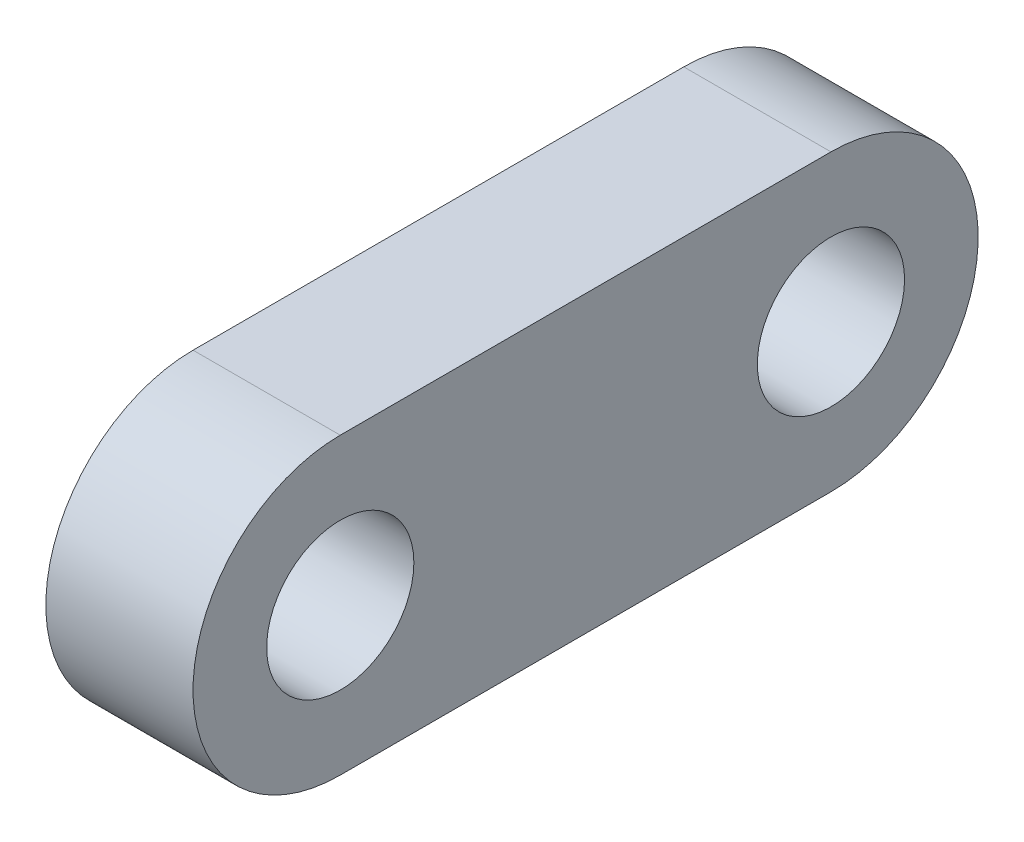
ISO-10303-21;
HEADER;
FILE_DESCRIPTION(('STEP AP214'),'2;1');
FILE_NAME('part.step','',(''),(''),'','','');
FILE_SCHEMA(('AUTOMOTIVE_DESIGN { 1 0 10303 214 1 1 1 1 }'));
ENDSEC;
DATA;
#1=APPLICATION_CONTEXT('core data for automotive mechanical design processes');
#2=APPLICATION_PROTOCOL_DEFINITION('international standard','automotive_design',2000,#1);
#3=PRODUCT_CONTEXT('',#1,'mechanical');
#4=PRODUCT('Part','Part','',(#3));
#5=PRODUCT_RELATED_PRODUCT_CATEGORY('part','',(#4));
#6=PRODUCT_DEFINITION_FORMATION('','',#4);
#7=PRODUCT_DEFINITION_CONTEXT('part definition',#1,'design');
#8=PRODUCT_DEFINITION('design','',#6,#7);
#9=PRODUCT_DEFINITION_SHAPE('','',#8);
#10=(LENGTH_UNIT() NAMED_UNIT(*) SI_UNIT(.MILLI.,.METRE.));
#11=(NAMED_UNIT(*) PLANE_ANGLE_UNIT() SI_UNIT($,.RADIAN.));
#12=(NAMED_UNIT(*) SI_UNIT($,.STERADIAN.) SOLID_ANGLE_UNIT());
#13=UNCERTAINTY_MEASURE_WITH_UNIT(LENGTH_MEASURE(1.E-05),#10,'distance_accuracy_value','');
#14=(GEOMETRIC_REPRESENTATION_CONTEXT(3) GLOBAL_UNCERTAINTY_ASSIGNED_CONTEXT((#13)) GLOBAL_UNIT_ASSIGNED_CONTEXT((#10,
#11,#12)) REPRESENTATION_CONTEXT('',''));
#15=CARTESIAN_POINT('',(0.,0.,0.));
#16=DIRECTION('',(0.,0.,1.));
#17=DIRECTION('',(1.,0.,0.));
#18=AXIS2_PLACEMENT_3D('',#15,#16,#17);
#19=CARTESIAN_POINT('',(3.,1.5,0.));
#20=DIRECTION('',(1.,0.,0.));
#21=DIRECTION('',(0.,0.,-1.));
#22=AXIS2_PLACEMENT_3D('',#19,#20,#21);
#23=PLANE('',#22);
#24=CARTESIAN_POINT('',(3.,1.5,0.));
#25=DIRECTION('',(1.,0.,0.));
#26=DIRECTION('',(0.,0.,-1.));
#27=AXIS2_PLACEMENT_3D('',#24,#25,#26);
#28=CIRCLE('',#27,1.5);
#29=CARTESIAN_POINT('',(3.,1.5,-1.5));
#30=VERTEX_POINT('',#29);
#31=EDGE_CURVE('E107',#30,#30,#28,.T.);
#32=ORIENTED_EDGE('',*,*,#31,.F.);
#33=EDGE_LOOP('',(#32));
#34=FACE_BOUND('',#33,.T.);
#35=CARTESIAN_POINT('',(3.,1.5,0.));
#36=DIRECTION('',(1.,0.,0.));
#37=DIRECTION('',(0.,0.,-1.));
#38=AXIS2_PLACEMENT_3D('',#35,#36,#37);
#39=CIRCLE('',#38,3.);
#40=CARTESIAN_POINT('',(3.,4.5,0.));
#41=VERTEX_POINT('',#40);
#42=CARTESIAN_POINT('',(3.,-1.5,0.));
#43=VERTEX_POINT('',#42);
#44=EDGE_CURVE('E92',#41,#43,#39,.T.);
#45=ORIENTED_EDGE('',*,*,#44,.T.);
#46=DIRECTION('',(0.,0.,-1.));
#47=VECTOR('',#46,1.);
#48=CARTESIAN_POINT('',(3.,-1.5,0.));
#49=LINE('',#48,#47);
#50=CARTESIAN_POINT('',(3.,-1.5,-10.));
#51=VERTEX_POINT('',#50);
#52=EDGE_CURVE('E87',#43,#51,#49,.T.);
#53=ORIENTED_EDGE('',*,*,#52,.T.);
#54=CARTESIAN_POINT('',(3.,1.5,-10.));
#55=DIRECTION('',(1.,0.,0.));
#56=DIRECTION('',(0.,0.,-1.));
#57=AXIS2_PLACEMENT_3D('',#54,#55,#56);
#58=CIRCLE('',#57,3.);
#59=CARTESIAN_POINT('',(3.,4.5,-10.));
#60=VERTEX_POINT('',#59);
#61=EDGE_CURVE('E90',#51,#60,#58,.T.);
#62=ORIENTED_EDGE('',*,*,#61,.T.);
#63=DIRECTION('',(0.,0.,1.));
#64=VECTOR('',#63,1.);
#65=CARTESIAN_POINT('',(3.,4.5,0.));
#66=LINE('',#65,#64);
#67=EDGE_CURVE('E57',#60,#41,#66,.T.);
#68=ORIENTED_EDGE('',*,*,#67,.T.);
#69=EDGE_LOOP('',(#45,#53,#62,#68));
#70=FACE_BOUND('',#69,.T.);
#71=CARTESIAN_POINT('',(3.,1.5,-10.));
#72=DIRECTION('',(1.,0.,0.));
#73=DIRECTION('',(0.,0.,-1.));
#74=AXIS2_PLACEMENT_3D('',#71,#72,#73);
#75=CIRCLE('',#74,1.5);
#76=CARTESIAN_POINT('',(3.,1.5,-11.5));
#77=VERTEX_POINT('',#76);
#78=EDGE_CURVE('E122',#77,#77,#75,.T.);
#79=ORIENTED_EDGE('',*,*,#78,.F.);
#80=EDGE_LOOP('',(#79));
#81=FACE_BOUND('',#80,.T.);
#82=ADVANCED_FACE('F40',(#34,#70,#81),#23,.T.);
#83=CARTESIAN_POINT('',(0.,1.5,0.));
#84=DIRECTION('',(1.,0.,0.));
#85=DIRECTION('',(0.,0.,-1.));
#86=AXIS2_PLACEMENT_3D('',#83,#84,#85);
#87=PLANE('',#86);
#88=CARTESIAN_POINT('',(0.,1.5,0.));
#89=DIRECTION('',(1.,0.,0.));
#90=DIRECTION('',(0.,0.,-1.));
#91=AXIS2_PLACEMENT_3D('',#88,#89,#90);
#92=CIRCLE('',#91,3.);
#93=CARTESIAN_POINT('',(0.,4.5,0.));
#94=VERTEX_POINT('',#93);
#95=CARTESIAN_POINT('',(0.,-1.5,0.));
#96=VERTEX_POINT('',#95);
#97=EDGE_CURVE('E104',#94,#96,#92,.T.);
#98=ORIENTED_EDGE('',*,*,#97,.F.);
#99=DIRECTION('',(0.,0.,1.));
#100=VECTOR('',#99,1.);
#101=CARTESIAN_POINT('',(0.,4.5,0.));
#102=LINE('',#101,#100);
#103=CARTESIAN_POINT('',(0.,4.5,-10.));
#104=VERTEX_POINT('',#103);
#105=EDGE_CURVE('E80',#104,#94,#102,.T.);
#106=ORIENTED_EDGE('',*,*,#105,.F.);
#107=CARTESIAN_POINT('',(0.,1.5,-10.));
#108=DIRECTION('',(1.,0.,0.));
#109=DIRECTION('',(0.,0.,-1.));
#110=AXIS2_PLACEMENT_3D('',#107,#108,#109);
#111=CIRCLE('',#110,3.);
#112=CARTESIAN_POINT('',(0.,-1.5,-10.));
#113=VERTEX_POINT('',#112);
#114=EDGE_CURVE('E74',#113,#104,#111,.T.);
#115=ORIENTED_EDGE('',*,*,#114,.F.);
#116=DIRECTION('',(0.,0.,-1.));
#117=VECTOR('',#116,1.);
#118=CARTESIAN_POINT('',(0.,-1.5,0.));
#119=LINE('',#118,#117);
#120=EDGE_CURVE('E96',#96,#113,#119,.T.);
#121=ORIENTED_EDGE('',*,*,#120,.F.);
#122=EDGE_LOOP('',(#98,#106,#115,#121));
#123=FACE_BOUND('',#122,.T.);
#124=CARTESIAN_POINT('',(0.,1.5,0.));
#125=DIRECTION('',(1.,0.,0.));
#126=DIRECTION('',(0.,0.,-1.));
#127=AXIS2_PLACEMENT_3D('',#124,#125,#126);
#128=CIRCLE('',#127,1.5);
#129=CARTESIAN_POINT('',(0.,1.5,-1.5));
#130=VERTEX_POINT('',#129);
#131=EDGE_CURVE('E119',#130,#130,#128,.T.);
#132=ORIENTED_EDGE('',*,*,#131,.T.);
#133=EDGE_LOOP('',(#132));
#134=FACE_BOUND('',#133,.T.);
#135=CARTESIAN_POINT('',(0.,1.5,-10.));
#136=DIRECTION('',(1.,0.,0.));
#137=DIRECTION('',(0.,0.,-1.));
#138=AXIS2_PLACEMENT_3D('',#135,#136,#137);
#139=CIRCLE('',#138,1.5);
#140=CARTESIAN_POINT('',(0.,1.5,-11.5));
#141=VERTEX_POINT('',#140);
#142=EDGE_CURVE('E125',#141,#141,#139,.T.);
#143=ORIENTED_EDGE('',*,*,#142,.T.);
#144=EDGE_LOOP('',(#143));
#145=FACE_BOUND('',#144,.T.);
#146=ADVANCED_FACE('F115',(#123,#134,#145),#87,.F.);
#147=CARTESIAN_POINT('',(3.,1.5,0.));
#148=DIRECTION('',(-1.,0.,0.));
#149=DIRECTION('',(0.,0.,1.));
#150=AXIS2_PLACEMENT_3D('',#147,#148,#149);
#151=CYLINDRICAL_SURFACE('',#150,3.);
#152=ORIENTED_EDGE('',*,*,#97,.T.);
#153=DIRECTION('',(-1.,0.,0.));
#154=VECTOR('',#153,1.);
#155=CARTESIAN_POINT('',(3.,-1.5,0.));
#156=LINE('',#155,#154);
#157=EDGE_CURVE('E11',#43,#96,#156,.T.);
#158=ORIENTED_EDGE('',*,*,#157,.F.);
#159=ORIENTED_EDGE('',*,*,#44,.F.);
#160=DIRECTION('',(-1.,0.,0.));
#161=VECTOR('',#160,1.);
#162=CARTESIAN_POINT('',(3.,4.5,0.));
#163=LINE('',#162,#161);
#164=EDGE_CURVE('E100',#41,#94,#163,.T.);
#165=ORIENTED_EDGE('',*,*,#164,.T.);
#166=EDGE_LOOP('',(#152,#158,#159,#165));
#167=FACE_BOUND('',#166,.T.);
#168=ADVANCED_FACE('F42',(#167),#151,.T.);
#169=CARTESIAN_POINT('',(3.,-1.5,0.));
#170=DIRECTION('',(0.,1.,0.));
#171=DIRECTION('',(0.,0.,1.));
#172=AXIS2_PLACEMENT_3D('',#169,#170,#171);
#173=PLANE('',#172);
#174=ORIENTED_EDGE('',*,*,#120,.T.);
#175=DIRECTION('',(-1.,0.,0.));
#176=VECTOR('',#175,1.);
#177=CARTESIAN_POINT('',(3.,-1.5,-10.));
#178=LINE('',#177,#176);
#179=EDGE_CURVE('E49',#51,#113,#178,.T.);
#180=ORIENTED_EDGE('',*,*,#179,.F.);
#181=ORIENTED_EDGE('',*,*,#52,.F.);
#182=ORIENTED_EDGE('',*,*,#157,.T.);
#183=EDGE_LOOP('',(#174,#180,#181,#182));
#184=FACE_BOUND('',#183,.T.);
#185=ADVANCED_FACE('F95',(#184),#173,.F.);
#186=CARTESIAN_POINT('',(3.,1.5,-10.));
#187=DIRECTION('',(-1.,0.,0.));
#188=DIRECTION('',(0.,0.,1.));
#189=AXIS2_PLACEMENT_3D('',#186,#187,#188);
#190=CYLINDRICAL_SURFACE('',#189,3.);
#191=ORIENTED_EDGE('',*,*,#114,.T.);
#192=DIRECTION('',(-1.,0.,0.));
#193=VECTOR('',#192,1.);
#194=CARTESIAN_POINT('',(3.,4.5,-10.));
#195=LINE('',#194,#193);
#196=EDGE_CURVE('E97',#60,#104,#195,.T.);
#197=ORIENTED_EDGE('',*,*,#196,.F.);
#198=ORIENTED_EDGE('',*,*,#61,.F.);
#199=ORIENTED_EDGE('',*,*,#179,.T.);
#200=EDGE_LOOP('',(#191,#197,#198,#199));
#201=FACE_BOUND('',#200,.T.);
#202=ADVANCED_FACE('F98',(#201),#190,.T.);
#203=CARTESIAN_POINT('',(3.,4.5,0.));
#204=DIRECTION('',(0.,-1.,0.));
#205=DIRECTION('',(0.,0.,-1.));
#206=AXIS2_PLACEMENT_3D('',#203,#204,#205);
#207=PLANE('',#206);
#208=ORIENTED_EDGE('',*,*,#105,.T.);
#209=ORIENTED_EDGE('',*,*,#164,.F.);
#210=ORIENTED_EDGE('',*,*,#67,.F.);
#211=ORIENTED_EDGE('',*,*,#196,.T.);
#212=EDGE_LOOP('',(#208,#209,#210,#211));
#213=FACE_BOUND('',#212,.T.);
#214=ADVANCED_FACE('F112',(#213),#207,.F.);
#215=CARTESIAN_POINT('',(3.,1.5,0.));
#216=DIRECTION('',(-1.,0.,0.));
#217=DIRECTION('',(0.,0.,1.));
#218=AXIS2_PLACEMENT_3D('',#215,#216,#217);
#219=CYLINDRICAL_SURFACE('',#218,1.5);
#220=ORIENTED_EDGE('',*,*,#31,.T.);
#221=EDGE_LOOP('',(#220));
#222=FACE_BOUND('',#221,.T.);
#223=ORIENTED_EDGE('',*,*,#131,.F.);
#224=EDGE_LOOP('',(#223));
#225=FACE_BOUND('',#224,.T.);
#226=ADVANCED_FACE('F142',(#222,#225),#219,.F.);
#227=CARTESIAN_POINT('',(3.,1.5,-10.));
#228=DIRECTION('',(-1.,0.,0.));
#229=DIRECTION('',(0.,0.,1.));
#230=AXIS2_PLACEMENT_3D('',#227,#228,#229);
#231=CYLINDRICAL_SURFACE('',#230,1.5);
#232=ORIENTED_EDGE('',*,*,#78,.T.);
#233=EDGE_LOOP('',(#232));
#234=FACE_BOUND('',#233,.T.);
#235=ORIENTED_EDGE('',*,*,#142,.F.);
#236=EDGE_LOOP('',(#235));
#237=FACE_BOUND('',#236,.T.);
#238=ADVANCED_FACE('F131',(#234,#237),#231,.F.);
#239=CLOSED_SHELL('',(#82,#146,#168,#185,#202,#214,#226,#238));
#240=MANIFOLD_SOLID_BREP('B2',#239);
#241=ADVANCED_BREP_SHAPE_REPRESENTATION('',(#18,#240),#14);
#242=SHAPE_DEFINITION_REPRESENTATION(#9,#241);
ENDSEC;
END-ISO-10303-21;
